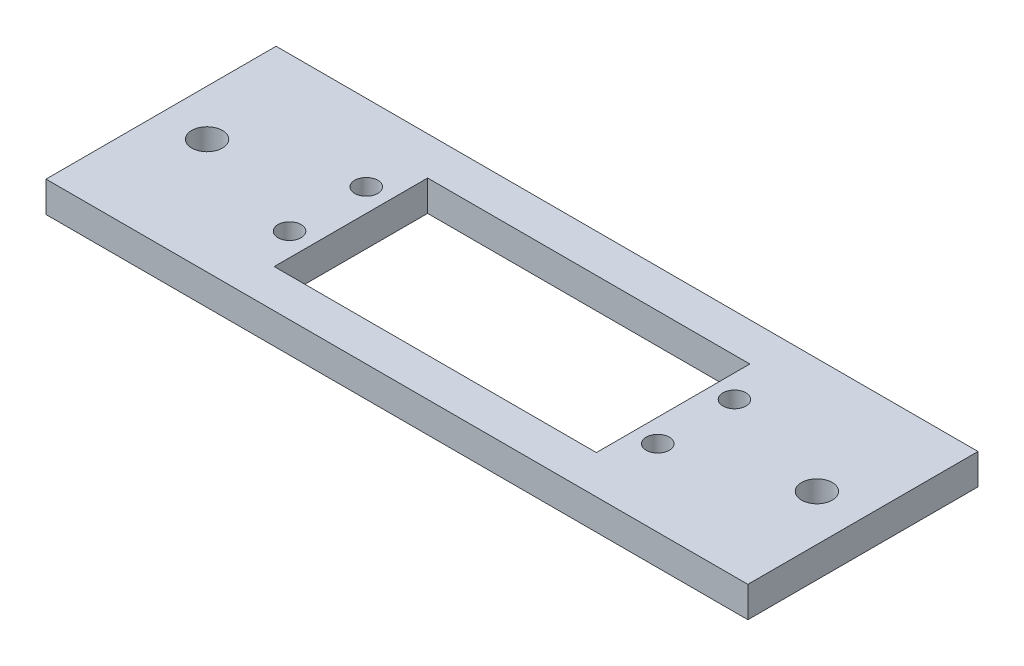
ISO-10303-21;
HEADER;
FILE_DESCRIPTION(('STEP AP214'),'2;1');
FILE_NAME('part.step','',(''),(''),'','','');
FILE_SCHEMA(('AUTOMOTIVE_DESIGN { 1 0 10303 214 1 1 1 1 }'));
ENDSEC;
DATA;
#1=APPLICATION_CONTEXT('core data for automotive mechanical design processes');
#2=APPLICATION_PROTOCOL_DEFINITION('international standard','automotive_design',2000,#1);
#3=PRODUCT_CONTEXT('',#1,'mechanical');
#4=PRODUCT('Part','Part','',(#3));
#5=PRODUCT_RELATED_PRODUCT_CATEGORY('part','',(#4));
#6=PRODUCT_DEFINITION_FORMATION('','',#4);
#7=PRODUCT_DEFINITION_CONTEXT('part definition',#1,'design');
#8=PRODUCT_DEFINITION('design','',#6,#7);
#9=PRODUCT_DEFINITION_SHAPE('','',#8);
#10=(LENGTH_UNIT() NAMED_UNIT(*) SI_UNIT(.MILLI.,.METRE.));
#11=(NAMED_UNIT(*) PLANE_ANGLE_UNIT() SI_UNIT($,.RADIAN.));
#12=(NAMED_UNIT(*) SI_UNIT($,.STERADIAN.) SOLID_ANGLE_UNIT());
#13=UNCERTAINTY_MEASURE_WITH_UNIT(LENGTH_MEASURE(1.E-05),#10,'distance_accuracy_value','');
#14=(GEOMETRIC_REPRESENTATION_CONTEXT(3) GLOBAL_UNCERTAINTY_ASSIGNED_CONTEXT((#13)) GLOBAL_UNIT_ASSIGNED_CONTEXT((#10,
#11,#12)) REPRESENTATION_CONTEXT('',''));
#15=CARTESIAN_POINT('',(0.,0.,0.));
#16=DIRECTION('',(0.,0.,1.));
#17=DIRECTION('',(1.,0.,0.));
#18=AXIS2_PLACEMENT_3D('',#15,#16,#17);
#19=CARTESIAN_POINT('',(0.,4.,0.));
#20=DIRECTION('',(0.,1.,0.));
#21=DIRECTION('',(0.,0.,1.));
#22=AXIS2_PLACEMENT_3D('',#19,#20,#21);
#23=PLANE('',#22);
#24=CARTESIAN_POINT('',(24.,4.,-5.));
#25=DIRECTION('',(0.,1.,0.));
#26=DIRECTION('',(0.,0.,-1.));
#27=AXIS2_PLACEMENT_3D('',#24,#25,#26);
#28=CIRCLE('',#27,1.49999999999999);
#29=CARTESIAN_POINT('',(24.,4.,-6.5));
#30=VERTEX_POINT('',#29);
#31=EDGE_CURVE('E298',#30,#30,#28,.T.);
#32=ORIENTED_EDGE('',*,*,#31,.F.);
#33=EDGE_LOOP('',(#32));
#34=FACE_BOUND('',#33,.T.);
#35=CARTESIAN_POINT('',(24.,4.,4.99999999999999));
#36=DIRECTION('',(0.,1.,0.));
#37=DIRECTION('',(0.,0.,1.));
#38=AXIS2_PLACEMENT_3D('',#35,#36,#37);
#39=CIRCLE('',#38,1.5);
#40=CARTESIAN_POINT('',(24.,4.,6.49999999999999));
#41=VERTEX_POINT('',#40);
#42=EDGE_CURVE('E288',#41,#41,#39,.T.);
#43=ORIENTED_EDGE('',*,*,#42,.F.);
#44=EDGE_LOOP('',(#43));
#45=FACE_BOUND('',#44,.T.);
#46=CARTESIAN_POINT('',(-24.,4.,5.));
#47=DIRECTION('',(0.,1.,0.));
#48=DIRECTION('',(0.,0.,-1.));
#49=AXIS2_PLACEMENT_3D('',#46,#47,#48);
#50=CIRCLE('',#49,1.5);
#51=CARTESIAN_POINT('',(-24.,4.,3.5));
#52=VERTEX_POINT('',#51);
#53=EDGE_CURVE('E278',#52,#52,#50,.T.);
#54=ORIENTED_EDGE('',*,*,#53,.F.);
#55=EDGE_LOOP('',(#54));
#56=FACE_BOUND('',#55,.T.);
#57=CARTESIAN_POINT('',(-24.,4.,-5.));
#58=DIRECTION('',(0.,1.,0.));
#59=DIRECTION('',(0.,0.,1.));
#60=AXIS2_PLACEMENT_3D('',#57,#58,#59);
#61=CIRCLE('',#60,1.5);
#62=CARTESIAN_POINT('',(-24.,4.,-3.5));
#63=VERTEX_POINT('',#62);
#64=EDGE_CURVE('E285',#63,#63,#61,.T.);
#65=ORIENTED_EDGE('',*,*,#64,.F.);
#66=EDGE_LOOP('',(#65));
#67=FACE_BOUND('',#66,.T.);
#68=CARTESIAN_POINT('',(-39.75,4.,0.));
#69=DIRECTION('',(0.,1.,0.));
#70=DIRECTION('',(0.,0.,1.));
#71=AXIS2_PLACEMENT_3D('',#68,#69,#70);
#72=CIRCLE('',#71,2.);
#73=CARTESIAN_POINT('',(-39.75,4.,2.));
#74=VERTEX_POINT('',#73);
#75=EDGE_CURVE('E140',#74,#74,#72,.T.);
#76=ORIENTED_EDGE('',*,*,#75,.F.);
#77=EDGE_LOOP('',(#76));
#78=FACE_BOUND('',#77,.T.);
#79=DIRECTION('',(0.,0.,1.));
#80=VECTOR('',#79,1.);
#81=CARTESIAN_POINT('',(-45.75,4.,-15.));
#82=LINE('',#81,#80);
#83=CARTESIAN_POINT('',(-45.75,4.,-15.));
#84=VERTEX_POINT('',#83);
#85=CARTESIAN_POINT('',(-45.75,4.,15.));
#86=VERTEX_POINT('',#85);
#87=EDGE_CURVE('E156',#84,#86,#82,.T.);
#88=ORIENTED_EDGE('',*,*,#87,.T.);
#89=DIRECTION('',(1.,0.,0.));
#90=VECTOR('',#89,1.);
#91=CARTESIAN_POINT('',(-45.75,4.,15.));
#92=LINE('',#91,#90);
#93=CARTESIAN_POINT('',(45.75,4.,15.));
#94=VERTEX_POINT('',#93);
#95=EDGE_CURVE('E160',#86,#94,#92,.T.);
#96=ORIENTED_EDGE('',*,*,#95,.T.);
#97=DIRECTION('',(0.,0.,-1.));
#98=VECTOR('',#97,1.);
#99=CARTESIAN_POINT('',(45.75,4.,-15.));
#100=LINE('',#99,#98);
#101=CARTESIAN_POINT('',(45.75,4.,-15.));
#102=VERTEX_POINT('',#101);
#103=EDGE_CURVE('E164',#94,#102,#100,.T.);
#104=ORIENTED_EDGE('',*,*,#103,.T.);
#105=DIRECTION('',(-1.,0.,0.));
#106=VECTOR('',#105,1.);
#107=CARTESIAN_POINT('',(-45.75,4.,-15.));
#108=LINE('',#107,#106);
#109=EDGE_CURVE('E167',#102,#84,#108,.T.);
#110=ORIENTED_EDGE('',*,*,#109,.T.);
#111=EDGE_LOOP('',(#88,#96,#104,#110));
#112=FACE_BOUND('',#111,.T.);
#113=DIRECTION('',(-1.,0.,0.));
#114=VECTOR('',#113,1.);
#115=CARTESIAN_POINT('',(-21.,4.,-10.));
#116=LINE('',#115,#114);
#117=CARTESIAN_POINT('',(21.,4.,-10.));
#118=VERTEX_POINT('',#117);
#119=CARTESIAN_POINT('',(-21.,4.,-10.));
#120=VERTEX_POINT('',#119);
#121=EDGE_CURVE('E114',#118,#120,#116,.T.);
#122=ORIENTED_EDGE('',*,*,#121,.F.);
#123=DIRECTION('',(0.,0.,-1.));
#124=VECTOR('',#123,1.);
#125=CARTESIAN_POINT('',(21.,4.,10.));
#126=LINE('',#125,#124);
#127=CARTESIAN_POINT('',(21.,4.,10.));
#128=VERTEX_POINT('',#127);
#129=EDGE_CURVE('E105',#128,#118,#126,.T.);
#130=ORIENTED_EDGE('',*,*,#129,.F.);
#131=DIRECTION('',(1.,0.,0.));
#132=VECTOR('',#131,1.);
#133=CARTESIAN_POINT('',(-21.,4.,10.));
#134=LINE('',#133,#132);
#135=CARTESIAN_POINT('',(-21.,4.,10.));
#136=VERTEX_POINT('',#135);
#137=EDGE_CURVE('E132',#136,#128,#134,.T.);
#138=ORIENTED_EDGE('',*,*,#137,.F.);
#139=DIRECTION('',(0.,0.,1.));
#140=VECTOR('',#139,1.);
#141=CARTESIAN_POINT('',(-21.,4.,10.));
#142=LINE('',#141,#140);
#143=EDGE_CURVE('E128',#120,#136,#142,.T.);
#144=ORIENTED_EDGE('',*,*,#143,.F.);
#145=EDGE_LOOP('',(#122,#130,#138,#144));
#146=FACE_BOUND('',#145,.T.);
#147=CARTESIAN_POINT('',(39.75,4.,0.));
#148=DIRECTION('',(0.,1.,0.));
#149=DIRECTION('',(0.,0.,-1.));
#150=AXIS2_PLACEMENT_3D('',#147,#148,#149);
#151=CIRCLE('',#150,2.00000000000002);
#152=CARTESIAN_POINT('',(39.75,4.,-2.00000000000003));
#153=VERTEX_POINT('',#152);
#154=EDGE_CURVE('E310',#153,#153,#151,.T.);
#155=ORIENTED_EDGE('',*,*,#154,.F.);
#156=EDGE_LOOP('',(#155));
#157=FACE_BOUND('',#156,.T.);
#158=ADVANCED_FACE('F39',(#34,#45,#56,#67,#78,#112,#146,#157),#23,.T.);
#159=CARTESIAN_POINT('',(0.,0.,0.));
#160=DIRECTION('',(0.,1.,0.));
#161=DIRECTION('',(0.,0.,1.));
#162=AXIS2_PLACEMENT_3D('',#159,#160,#161);
#163=PLANE('',#162);
#164=CARTESIAN_POINT('',(24.,0.,-5.));
#165=DIRECTION('',(0.,1.,0.));
#166=DIRECTION('',(0.,0.,-1.));
#167=AXIS2_PLACEMENT_3D('',#164,#165,#166);
#168=CIRCLE('',#167,1.49999999999999);
#169=CARTESIAN_POINT('',(24.,0.,-6.5));
#170=VERTEX_POINT('',#169);
#171=EDGE_CURVE('E294',#170,#170,#168,.T.);
#172=ORIENTED_EDGE('',*,*,#171,.T.);
#173=EDGE_LOOP('',(#172));
#174=FACE_BOUND('',#173,.T.);
#175=CARTESIAN_POINT('',(24.,0.,4.99999999999999));
#176=DIRECTION('',(0.,1.,0.));
#177=DIRECTION('',(0.,0.,1.));
#178=AXIS2_PLACEMENT_3D('',#175,#176,#177);
#179=CIRCLE('',#178,1.5);
#180=CARTESIAN_POINT('',(24.,0.,6.49999999999999));
#181=VERTEX_POINT('',#180);
#182=EDGE_CURVE('E281',#181,#181,#179,.T.);
#183=ORIENTED_EDGE('',*,*,#182,.T.);
#184=EDGE_LOOP('',(#183));
#185=FACE_BOUND('',#184,.T.);
#186=CARTESIAN_POINT('',(-24.,0.,5.));
#187=DIRECTION('',(0.,1.,0.));
#188=DIRECTION('',(0.,0.,-1.));
#189=AXIS2_PLACEMENT_3D('',#186,#187,#188);
#190=CIRCLE('',#189,1.5);
#191=CARTESIAN_POINT('',(-24.,0.,3.5));
#192=VERTEX_POINT('',#191);
#193=EDGE_CURVE('E275',#192,#192,#190,.T.);
#194=ORIENTED_EDGE('',*,*,#193,.T.);
#195=EDGE_LOOP('',(#194));
#196=FACE_BOUND('',#195,.T.);
#197=CARTESIAN_POINT('',(-24.,0.,-5.));
#198=DIRECTION('',(0.,1.,0.));
#199=DIRECTION('',(0.,0.,1.));
#200=AXIS2_PLACEMENT_3D('',#197,#198,#199);
#201=CIRCLE('',#200,1.5);
#202=CARTESIAN_POINT('',(-24.,0.,-3.5));
#203=VERTEX_POINT('',#202);
#204=EDGE_CURVE('E302',#203,#203,#201,.T.);
#205=ORIENTED_EDGE('',*,*,#204,.T.);
#206=EDGE_LOOP('',(#205));
#207=FACE_BOUND('',#206,.T.);
#208=DIRECTION('',(0.,0.,1.));
#209=VECTOR('',#208,1.);
#210=CARTESIAN_POINT('',(-45.75,0.,-15.));
#211=LINE('',#210,#209);
#212=CARTESIAN_POINT('',(-45.75,0.,-15.));
#213=VERTEX_POINT('',#212);
#214=CARTESIAN_POINT('',(-45.75,0.,15.));
#215=VERTEX_POINT('',#214);
#216=EDGE_CURVE('E123',#213,#215,#211,.T.);
#217=ORIENTED_EDGE('',*,*,#216,.F.);
#218=DIRECTION('',(-1.,0.,0.));
#219=VECTOR('',#218,1.);
#220=CARTESIAN_POINT('',(-45.75,0.,-15.));
#221=LINE('',#220,#219);
#222=CARTESIAN_POINT('',(45.75,0.,-15.));
#223=VERTEX_POINT('',#222);
#224=EDGE_CURVE('E161',#223,#213,#221,.T.);
#225=ORIENTED_EDGE('',*,*,#224,.F.);
#226=DIRECTION('',(0.,0.,-1.));
#227=VECTOR('',#226,1.);
#228=CARTESIAN_POINT('',(45.75,0.,-15.));
#229=LINE('',#228,#227);
#230=CARTESIAN_POINT('',(45.75,0.,15.));
#231=VERTEX_POINT('',#230);
#232=EDGE_CURVE('E177',#231,#223,#229,.T.);
#233=ORIENTED_EDGE('',*,*,#232,.F.);
#234=DIRECTION('',(1.,0.,0.));
#235=VECTOR('',#234,1.);
#236=CARTESIAN_POINT('',(-45.75,0.,15.));
#237=LINE('',#236,#235);
#238=EDGE_CURVE('E174',#215,#231,#237,.T.);
#239=ORIENTED_EDGE('',*,*,#238,.F.);
#240=EDGE_LOOP('',(#217,#225,#233,#239));
#241=FACE_BOUND('',#240,.T.);
#242=DIRECTION('',(0.,0.,-1.));
#243=VECTOR('',#242,1.);
#244=CARTESIAN_POINT('',(21.,0.,10.));
#245=LINE('',#244,#243);
#246=CARTESIAN_POINT('',(21.,0.,10.));
#247=VERTEX_POINT('',#246);
#248=CARTESIAN_POINT('',(21.,0.,-10.));
#249=VERTEX_POINT('',#248);
#250=EDGE_CURVE('E63',#247,#249,#245,.T.);
#251=ORIENTED_EDGE('',*,*,#250,.T.);
#252=DIRECTION('',(-1.,0.,0.));
#253=VECTOR('',#252,1.);
#254=CARTESIAN_POINT('',(-21.,0.,-10.));
#255=LINE('',#254,#253);
#256=CARTESIAN_POINT('',(-21.,0.,-10.));
#257=VERTEX_POINT('',#256);
#258=EDGE_CURVE('E121',#249,#257,#255,.T.);
#259=ORIENTED_EDGE('',*,*,#258,.T.);
#260=DIRECTION('',(0.,0.,1.));
#261=VECTOR('',#260,1.);
#262=CARTESIAN_POINT('',(-21.,0.,10.));
#263=LINE('',#262,#261);
#264=CARTESIAN_POINT('',(-21.,0.,10.));
#265=VERTEX_POINT('',#264);
#266=EDGE_CURVE('E143',#257,#265,#263,.T.);
#267=ORIENTED_EDGE('',*,*,#266,.T.);
#268=DIRECTION('',(1.,0.,0.));
#269=VECTOR('',#268,1.);
#270=CARTESIAN_POINT('',(-21.,0.,10.));
#271=LINE('',#270,#269);
#272=EDGE_CURVE('E115',#265,#247,#271,.T.);
#273=ORIENTED_EDGE('',*,*,#272,.T.);
#274=EDGE_LOOP('',(#251,#259,#267,#273));
#275=FACE_BOUND('',#274,.T.);
#276=CARTESIAN_POINT('',(-39.75,0.,0.));
#277=DIRECTION('',(0.,1.,0.));
#278=DIRECTION('',(0.,0.,1.));
#279=AXIS2_PLACEMENT_3D('',#276,#277,#278);
#280=CIRCLE('',#279,2.);
#281=CARTESIAN_POINT('',(-39.75,0.,2.));
#282=VERTEX_POINT('',#281);
#283=EDGE_CURVE('E314',#282,#282,#280,.T.);
#284=ORIENTED_EDGE('',*,*,#283,.T.);
#285=EDGE_LOOP('',(#284));
#286=FACE_BOUND('',#285,.T.);
#287=CARTESIAN_POINT('',(39.75,0.,0.));
#288=DIRECTION('',(0.,1.,0.));
#289=DIRECTION('',(0.,0.,-1.));
#290=AXIS2_PLACEMENT_3D('',#287,#288,#289);
#291=CIRCLE('',#290,2.00000000000002);
#292=CARTESIAN_POINT('',(39.75,0.,-2.00000000000003));
#293=VERTEX_POINT('',#292);
#294=EDGE_CURVE('E306',#293,#293,#291,.T.);
#295=ORIENTED_EDGE('',*,*,#294,.T.);
#296=EDGE_LOOP('',(#295));
#297=FACE_BOUND('',#296,.T.);
#298=ADVANCED_FACE('F200',(#174,#185,#196,#207,#241,#275,#286,#297),#163,.F.);
#299=CARTESIAN_POINT('',(-45.75,4.,-15.));
#300=DIRECTION('',(1.,0.,0.));
#301=DIRECTION('',(0.,0.,-1.));
#302=AXIS2_PLACEMENT_3D('',#299,#300,#301);
#303=PLANE('',#302);
#304=ORIENTED_EDGE('',*,*,#216,.T.);
#305=DIRECTION('',(0.,-1.,0.));
#306=VECTOR('',#305,1.);
#307=CARTESIAN_POINT('',(-45.75,4.,15.));
#308=LINE('',#307,#306);
#309=EDGE_CURVE('E11',#86,#215,#308,.T.);
#310=ORIENTED_EDGE('',*,*,#309,.F.);
#311=ORIENTED_EDGE('',*,*,#87,.F.);
#312=DIRECTION('',(0.,-1.,0.));
#313=VECTOR('',#312,1.);
#314=CARTESIAN_POINT('',(-45.75,4.,-15.));
#315=LINE('',#314,#313);
#316=EDGE_CURVE('E170',#84,#213,#315,.T.);
#317=ORIENTED_EDGE('',*,*,#316,.T.);
#318=EDGE_LOOP('',(#304,#310,#311,#317));
#319=FACE_BOUND('',#318,.T.);
#320=ADVANCED_FACE('F41',(#319),#303,.F.);
#321=CARTESIAN_POINT('',(-45.75,4.,15.));
#322=DIRECTION('',(0.,0.,-1.));
#323=DIRECTION('',(-1.,0.,0.));
#324=AXIS2_PLACEMENT_3D('',#321,#322,#323);
#325=PLANE('',#324);
#326=ORIENTED_EDGE('',*,*,#238,.T.);
#327=DIRECTION('',(0.,-1.,0.));
#328=VECTOR('',#327,1.);
#329=CARTESIAN_POINT('',(45.75,4.,15.));
#330=LINE('',#329,#328);
#331=EDGE_CURVE('E48',#94,#231,#330,.T.);
#332=ORIENTED_EDGE('',*,*,#331,.F.);
#333=ORIENTED_EDGE('',*,*,#95,.F.);
#334=ORIENTED_EDGE('',*,*,#309,.T.);
#335=EDGE_LOOP('',(#326,#332,#333,#334));
#336=FACE_BOUND('',#335,.T.);
#337=ADVANCED_FACE('F210',(#336),#325,.F.);
#338=CARTESIAN_POINT('',(45.75,4.,-15.));
#339=DIRECTION('',(-1.,0.,0.));
#340=DIRECTION('',(0.,0.,1.));
#341=AXIS2_PLACEMENT_3D('',#338,#339,#340);
#342=PLANE('',#341);
#343=ORIENTED_EDGE('',*,*,#232,.T.);
#344=DIRECTION('',(0.,-1.,0.));
#345=VECTOR('',#344,1.);
#346=CARTESIAN_POINT('',(45.75,4.,-15.));
#347=LINE('',#346,#345);
#348=EDGE_CURVE('E185',#102,#223,#347,.T.);
#349=ORIENTED_EDGE('',*,*,#348,.F.);
#350=ORIENTED_EDGE('',*,*,#103,.F.);
#351=ORIENTED_EDGE('',*,*,#331,.T.);
#352=EDGE_LOOP('',(#343,#349,#350,#351));
#353=FACE_BOUND('',#352,.T.);
#354=ADVANCED_FACE('F194',(#353),#342,.F.);
#355=CARTESIAN_POINT('',(-45.75,4.,-15.));
#356=DIRECTION('',(0.,0.,1.));
#357=DIRECTION('',(1.,0.,0.));
#358=AXIS2_PLACEMENT_3D('',#355,#356,#357);
#359=PLANE('',#358);
#360=ORIENTED_EDGE('',*,*,#224,.T.);
#361=ORIENTED_EDGE('',*,*,#316,.F.);
#362=ORIENTED_EDGE('',*,*,#109,.F.);
#363=ORIENTED_EDGE('',*,*,#348,.T.);
#364=EDGE_LOOP('',(#360,#361,#362,#363));
#365=FACE_BOUND('',#364,.T.);
#366=ADVANCED_FACE('F204',(#365),#359,.F.);
#367=CARTESIAN_POINT('',(21.,4.,10.));
#368=DIRECTION('',(-1.,0.,0.));
#369=DIRECTION('',(0.,0.,1.));
#370=AXIS2_PLACEMENT_3D('',#367,#368,#369);
#371=PLANE('',#370);
#372=ORIENTED_EDGE('',*,*,#250,.F.);
#373=DIRECTION('',(0.,-1.,0.));
#374=VECTOR('',#373,1.);
#375=CARTESIAN_POINT('',(21.,4.,10.));
#376=LINE('',#375,#374);
#377=EDGE_CURVE('E109',#128,#247,#376,.T.);
#378=ORIENTED_EDGE('',*,*,#377,.F.);
#379=ORIENTED_EDGE('',*,*,#129,.T.);
#380=DIRECTION('',(0.,-1.,0.));
#381=VECTOR('',#380,1.);
#382=CARTESIAN_POINT('',(21.,4.,-10.));
#383=LINE('',#382,#381);
#384=EDGE_CURVE('E108',#118,#249,#383,.T.);
#385=ORIENTED_EDGE('',*,*,#384,.T.);
#386=EDGE_LOOP('',(#372,#378,#379,#385));
#387=FACE_BOUND('',#386,.T.);
#388=ADVANCED_FACE('F107',(#387),#371,.T.);
#389=CARTESIAN_POINT('',(-21.,4.,-10.));
#390=DIRECTION('',(0.,0.,1.));
#391=DIRECTION('',(1.,0.,0.));
#392=AXIS2_PLACEMENT_3D('',#389,#390,#391);
#393=PLANE('',#392);
#394=ORIENTED_EDGE('',*,*,#258,.F.);
#395=ORIENTED_EDGE('',*,*,#384,.F.);
#396=ORIENTED_EDGE('',*,*,#121,.T.);
#397=DIRECTION('',(0.,-1.,0.));
#398=VECTOR('',#397,1.);
#399=CARTESIAN_POINT('',(-21.,4.,-10.));
#400=LINE('',#399,#398);
#401=EDGE_CURVE('E124',#120,#257,#400,.T.);
#402=ORIENTED_EDGE('',*,*,#401,.T.);
#403=EDGE_LOOP('',(#394,#395,#396,#402));
#404=FACE_BOUND('',#403,.T.);
#405=ADVANCED_FACE('F118',(#404),#393,.T.);
#406=CARTESIAN_POINT('',(-21.,4.,10.));
#407=DIRECTION('',(1.,0.,0.));
#408=DIRECTION('',(0.,0.,-1.));
#409=AXIS2_PLACEMENT_3D('',#406,#407,#408);
#410=PLANE('',#409);
#411=ORIENTED_EDGE('',*,*,#266,.F.);
#412=ORIENTED_EDGE('',*,*,#401,.F.);
#413=ORIENTED_EDGE('',*,*,#143,.T.);
#414=DIRECTION('',(0.,-1.,0.));
#415=VECTOR('',#414,1.);
#416=CARTESIAN_POINT('',(-21.,4.,10.));
#417=LINE('',#416,#415);
#418=EDGE_CURVE('E55',#136,#265,#417,.T.);
#419=ORIENTED_EDGE('',*,*,#418,.T.);
#420=EDGE_LOOP('',(#411,#412,#413,#419));
#421=FACE_BOUND('',#420,.T.);
#422=ADVANCED_FACE('F237',(#421),#410,.T.);
#423=CARTESIAN_POINT('',(-21.,4.,10.));
#424=DIRECTION('',(0.,0.,-1.));
#425=DIRECTION('',(-1.,0.,0.));
#426=AXIS2_PLACEMENT_3D('',#423,#424,#425);
#427=PLANE('',#426);
#428=ORIENTED_EDGE('',*,*,#272,.F.);
#429=ORIENTED_EDGE('',*,*,#418,.F.);
#430=ORIENTED_EDGE('',*,*,#137,.T.);
#431=ORIENTED_EDGE('',*,*,#377,.T.);
#432=EDGE_LOOP('',(#428,#429,#430,#431));
#433=FACE_BOUND('',#432,.T.);
#434=ADVANCED_FACE('F241',(#433),#427,.T.);
#435=CARTESIAN_POINT('',(-39.75,4.,0.));
#436=DIRECTION('',(0.,-1.,0.));
#437=DIRECTION('',(0.,0.,-1.));
#438=AXIS2_PLACEMENT_3D('',#435,#436,#437);
#439=CYLINDRICAL_SURFACE('',#438,2.);
#440=ORIENTED_EDGE('',*,*,#75,.T.);
#441=EDGE_LOOP('',(#440));
#442=FACE_BOUND('',#441,.T.);
#443=ORIENTED_EDGE('',*,*,#283,.F.);
#444=EDGE_LOOP('',(#443));
#445=FACE_BOUND('',#444,.T.);
#446=ADVANCED_FACE('F247',(#442,#445),#439,.F.);
#447=CARTESIAN_POINT('',(39.75,4.,0.));
#448=DIRECTION('',(0.,-1.,0.));
#449=DIRECTION('',(0.,0.,-1.));
#450=AXIS2_PLACEMENT_3D('',#447,#448,#449);
#451=CYLINDRICAL_SURFACE('',#450,2.00000000000002);
#452=ORIENTED_EDGE('',*,*,#154,.T.);
#453=EDGE_LOOP('',(#452));
#454=FACE_BOUND('',#453,.T.);
#455=ORIENTED_EDGE('',*,*,#294,.F.);
#456=EDGE_LOOP('',(#455));
#457=FACE_BOUND('',#456,.T.);
#458=ADVANCED_FACE('F250',(#454,#457),#451,.F.);
#459=CARTESIAN_POINT('',(-24.,0.,-5.));
#460=DIRECTION('',(0.,1.,0.));
#461=DIRECTION('',(0.,0.,1.));
#462=AXIS2_PLACEMENT_3D('',#459,#460,#461);
#463=CYLINDRICAL_SURFACE('',#462,1.5);
#464=ORIENTED_EDGE('',*,*,#204,.F.);
#465=EDGE_LOOP('',(#464));
#466=FACE_BOUND('',#465,.T.);
#467=ORIENTED_EDGE('',*,*,#64,.T.);
#468=EDGE_LOOP('',(#467));
#469=FACE_BOUND('',#468,.T.);
#470=ADVANCED_FACE('F254',(#466,#469),#463,.F.);
#471=CARTESIAN_POINT('',(-24.,0.,5.));
#472=DIRECTION('',(0.,1.,0.));
#473=DIRECTION('',(0.,0.,1.));
#474=AXIS2_PLACEMENT_3D('',#471,#472,#473);
#475=CYLINDRICAL_SURFACE('',#474,1.5);
#476=ORIENTED_EDGE('',*,*,#193,.F.);
#477=EDGE_LOOP('',(#476));
#478=FACE_BOUND('',#477,.T.);
#479=ORIENTED_EDGE('',*,*,#53,.T.);
#480=EDGE_LOOP('',(#479));
#481=FACE_BOUND('',#480,.T.);
#482=ADVANCED_FACE('F258',(#478,#481),#475,.F.);
#483=CARTESIAN_POINT('',(24.,0.,4.99999999999999));
#484=DIRECTION('',(0.,1.,0.));
#485=DIRECTION('',(0.,0.,1.));
#486=AXIS2_PLACEMENT_3D('',#483,#484,#485);
#487=CYLINDRICAL_SURFACE('',#486,1.5);
#488=ORIENTED_EDGE('',*,*,#182,.F.);
#489=EDGE_LOOP('',(#488));
#490=FACE_BOUND('',#489,.T.);
#491=ORIENTED_EDGE('',*,*,#42,.T.);
#492=EDGE_LOOP('',(#491));
#493=FACE_BOUND('',#492,.T.);
#494=ADVANCED_FACE('F263',(#490,#493),#487,.F.);
#495=CARTESIAN_POINT('',(24.,0.,-5.));
#496=DIRECTION('',(0.,1.,0.));
#497=DIRECTION('',(0.,0.,1.));
#498=AXIS2_PLACEMENT_3D('',#495,#496,#497);
#499=CYLINDRICAL_SURFACE('',#498,1.49999999999999);
#500=ORIENTED_EDGE('',*,*,#171,.F.);
#501=EDGE_LOOP('',(#500));
#502=FACE_BOUND('',#501,.T.);
#503=ORIENTED_EDGE('',*,*,#31,.T.);
#504=EDGE_LOOP('',(#503));
#505=FACE_BOUND('',#504,.T.);
#506=ADVANCED_FACE('F260',(#502,#505),#499,.F.);
#507=CLOSED_SHELL('',(#158,#298,#320,#337,#354,#366,#388,#405,#422,#434,#446,#458,#470,#482,
#494,#506));
#508=MANIFOLD_SOLID_BREP('B2',#507);
#509=ADVANCED_BREP_SHAPE_REPRESENTATION('',(#18,#508),#14);
#510=SHAPE_DEFINITION_REPRESENTATION(#9,#509);
ENDSEC;
END-ISO-10303-21;
